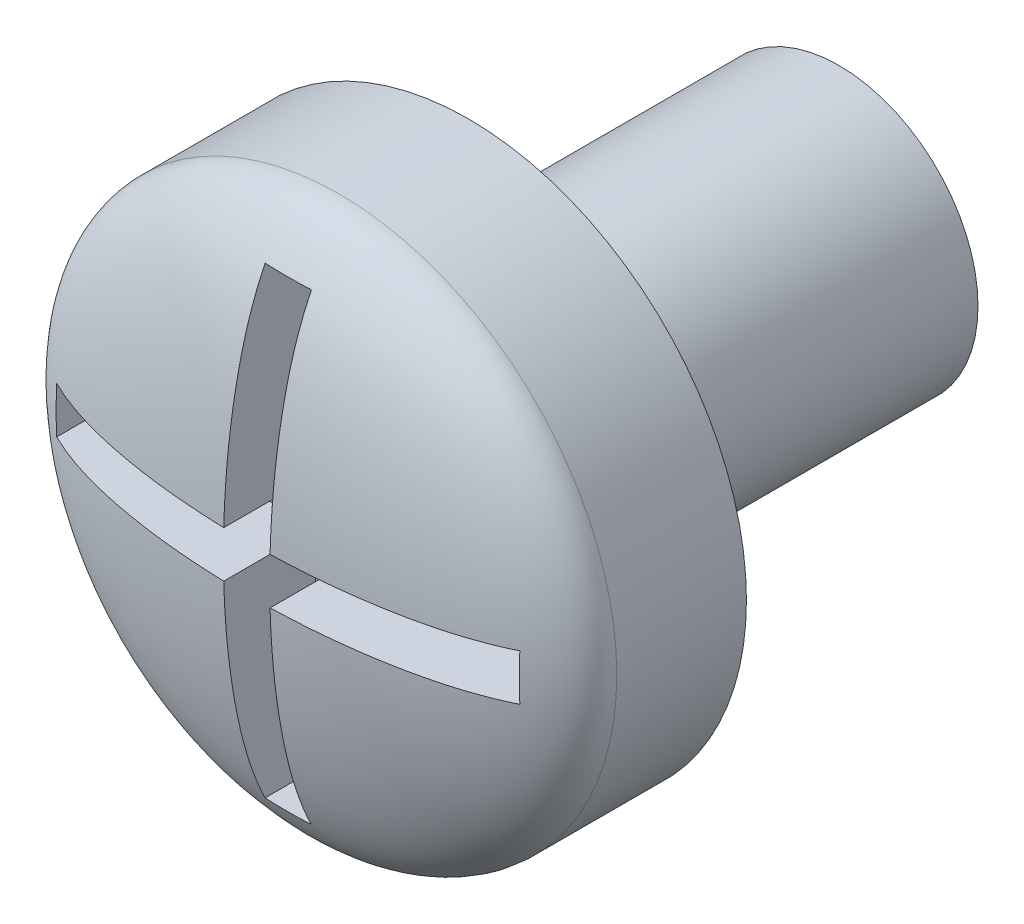
ISO-10303-21;
HEADER;
FILE_DESCRIPTION(('STEP AP214'),'2;1');
FILE_NAME('part.step','',(''),(''),'','','');
FILE_SCHEMA(('AUTOMOTIVE_DESIGN { 1 0 10303 214 1 1 1 1 }'));
ENDSEC;
DATA;
#1=APPLICATION_CONTEXT('core data for automotive mechanical design processes');
#2=APPLICATION_PROTOCOL_DEFINITION('international standard','automotive_design',2000,#1);
#3=PRODUCT_CONTEXT('',#1,'mechanical');
#4=PRODUCT('Part','Part','',(#3));
#5=PRODUCT_RELATED_PRODUCT_CATEGORY('part','',(#4));
#6=PRODUCT_DEFINITION_FORMATION('','',#4);
#7=PRODUCT_DEFINITION_CONTEXT('part definition',#1,'design');
#8=PRODUCT_DEFINITION('design','',#6,#7);
#9=PRODUCT_DEFINITION_SHAPE('','',#8);
#10=(LENGTH_UNIT() NAMED_UNIT(*) SI_UNIT(.MILLI.,.METRE.));
#11=(NAMED_UNIT(*) PLANE_ANGLE_UNIT() SI_UNIT($,.RADIAN.));
#12=(NAMED_UNIT(*) SI_UNIT($,.STERADIAN.) SOLID_ANGLE_UNIT());
#13=UNCERTAINTY_MEASURE_WITH_UNIT(LENGTH_MEASURE(1.E-05),#10,'distance_accuracy_value','');
#14=(GEOMETRIC_REPRESENTATION_CONTEXT(3) GLOBAL_UNCERTAINTY_ASSIGNED_CONTEXT((#13)) GLOBAL_UNIT_ASSIGNED_CONTEXT((#10,
#11,#12)) REPRESENTATION_CONTEXT('',''));
#15=CARTESIAN_POINT('',(0.,0.,0.));
#16=DIRECTION('',(0.,0.,1.));
#17=DIRECTION('',(1.,0.,0.));
#18=AXIS2_PLACEMENT_3D('',#15,#16,#17);
#19=CARTESIAN_POINT('',(0.,0.,-2.4));
#20=DIRECTION('',(0.,0.,1.));
#21=DIRECTION('',(1.,0.,0.));
#22=AXIS2_PLACEMENT_3D('',#19,#20,#21);
#23=CYLINDRICAL_SURFACE('',#22,3.);
#24=CARTESIAN_POINT('',(0.,0.,-2.4));
#25=DIRECTION('',(0.,0.,1.));
#26=DIRECTION('',(1.,0.,0.));
#27=AXIS2_PLACEMENT_3D('',#24,#25,#26);
#28=CIRCLE('',#27,3.);
#29=CARTESIAN_POINT('',(3.,0.,-2.4));
#30=VERTEX_POINT('',#29);
#31=EDGE_CURVE('E200',#30,#30,#28,.T.);
#32=ORIENTED_EDGE('',*,*,#31,.T.);
#33=EDGE_LOOP('',(#32));
#34=FACE_BOUND('',#33,.T.);
#35=CARTESIAN_POINT('',(0.,0.,-0.999999999999999));
#36=DIRECTION('',(0.,0.,1.));
#37=DIRECTION('',(1.,0.,0.));
#38=AXIS2_PLACEMENT_3D('',#35,#36,#37);
#39=CIRCLE('',#38,3.);
#40=CARTESIAN_POINT('',(3.,0.,-0.999999999999999));
#41=VERTEX_POINT('',#40);
#42=EDGE_CURVE('E199',#41,#41,#39,.T.);
#43=ORIENTED_EDGE('',*,*,#42,.F.);
#44=EDGE_LOOP('',(#43));
#45=FACE_BOUND('',#44,.T.);
#46=ADVANCED_FACE('F32',(#34,#45),#23,.T.);
#47=CARTESIAN_POINT('',(0.,0.,-2.4));
#48=DIRECTION('',(0.,0.,1.));
#49=DIRECTION('',(1.,0.,0.));
#50=AXIS2_PLACEMENT_3D('',#47,#48,#49);
#51=PLANE('',#50);
#52=CARTESIAN_POINT('',(0.,0.,-2.4));
#53=DIRECTION('',(0.,0.,1.));
#54=DIRECTION('',(1.,0.,0.));
#55=AXIS2_PLACEMENT_3D('',#52,#53,#54);
#56=CIRCLE('',#55,1.5);
#57=CARTESIAN_POINT('',(1.5,0.,-2.4));
#58=VERTEX_POINT('',#57);
#59=EDGE_CURVE('E203',#58,#58,#56,.F.);
#60=ORIENTED_EDGE('',*,*,#59,.F.);
#61=EDGE_LOOP('',(#60));
#62=FACE_BOUND('',#61,.T.);
#63=ORIENTED_EDGE('',*,*,#31,.F.);
#64=EDGE_LOOP('',(#63));
#65=FACE_BOUND('',#64,.T.);
#66=ADVANCED_FACE('F238',(#62,#65),#51,.F.);
#67=CARTESIAN_POINT('',(0.,0.,-0.999999999999999));
#68=DIRECTION('',(0.,1.,0.));
#69=DIRECTION('',(1.,0.,0.));
#70=AXIS2_PLACEMENT_3D('',#67,#68,#69);
#71=ELLIPSE('',#70,3.,1.);
#72=TRIMMED_CURVE('',#71,(PARAMETER_VALUE(4.71238898038469)),
(PARAMETER_VALUE(7.85398163397448)),.T.,.PARAMETER.);
#73=CARTESIAN_POINT('',(0.,0.,-2.));
#74=DIRECTION('',(0.,0.,1.));
#75=AXIS1_PLACEMENT('',#73,#74);
#76=SURFACE_OF_REVOLUTION('',#72,#75);
#77=CARTESIAN_POINT('',(-2.49999999999994,0.249999999999993,-0.453546789641425));
#78=CARTESIAN_POINT('',(-2.49999999999999,0.166666666666663,-0.449335064285271));
#79=CARTESIAN_POINT('',(-2.50000000000002,0.0833333333333335,-0.447229201607193));
#80=CARTESIAN_POINT('',(-2.49999999999999,-0.0833333333333263,-0.447229201607193));
#81=CARTESIAN_POINT('',(-2.49999999999994,-0.166666666666656,-0.449335064285271));
#82=CARTESIAN_POINT('',(-2.49999999999986,-0.249999999999986,-0.453546789641425));
#83=B_SPLINE_CURVE_WITH_KNOTS('',3,(#77,#78,#79,#80,#81,#82),.UNSPECIFIED.,.F.,.F.,(4,2,4),(0.,
0.250079811097508,0.500159622195015),.UNSPECIFIED.);
#84=CARTESIAN_POINT('',(-2.5,0.25,-0.453546789641425));
#85=VERTEX_POINT('',#84);
#86=CARTESIAN_POINT('',(-2.49999999999994,-0.249999999999993,-0.453546789641429));
#87=VERTEX_POINT('',#86);
#88=EDGE_CURVE('E11',#85,#87,#83,.T.);
#89=ORIENTED_EDGE('',*,*,#88,.F.);
#90=CARTESIAN_POINT('',(-2.49999999999994,0.249999999999993,-0.453546789641425));
#91=CARTESIAN_POINT('',(-2.47401567432464,0.249999999999998,-0.44034440705814));
#92=CARTESIAN_POINT('',(-2.44776636255155,0.249999999999999,-0.427678861070425));
#93=CARTESIAN_POINT('',(-2.39483295489631,0.250000000000001,-0.403312449564529));
#94=CARTESIAN_POINT('',(-2.36814899996362,0.25,-0.391611278487393));
#95=CARTESIAN_POINT('',(-2.28772571823395,0.25,-0.357847320134661));
#96=CARTESIAN_POINT('',(-2.23345635202142,0.25,-0.337045416976589));
#97=CARTESIAN_POINT('',(-2.12398602557991,0.25,-0.298212200007187));
#98=CARTESIAN_POINT('',(-2.06878561325245,0.25,-0.28017931576233));
#99=CARTESIAN_POINT('',(-1.9581785557007,0.25,-0.246594440138073));
#100=CARTESIAN_POINT('',(-1.90277817026711,0.25,-0.231021703137642));
#101=CARTESIAN_POINT('',(-1.79142093080343,0.25,-0.20185449827508));
#102=CARTESIAN_POINT('',(-1.73546371093185,0.25,-0.188261437293503));
#103=CARTESIAN_POINT('',(-1.62313622908068,0.25,-0.162839723341837));
#104=CARTESIAN_POINT('',(-1.56676585792357,0.25,-0.151011555790118));
#105=CARTESIAN_POINT('',(-1.44143294937792,0.25,-0.126556589218447));
#106=CARTESIAN_POINT('',(-1.37239543288092,0.25,-0.114314593740788));
#107=CARTESIAN_POINT('',(-1.23399641999479,0.25,-0.0919704062441796));
#108=CARTESIAN_POINT('',(-1.16463501312236,0.25,-0.0818676550593157));
#109=CARTESIAN_POINT('',(-1.02565643100745,0.25,-0.0636296146532634));
#110=CARTESIAN_POINT('',(-0.95603925992339,0.25,-0.0554942935864466));
#111=CARTESIAN_POINT('',(-0.815829605703759,0.25,-0.0409861198258272));
#112=CARTESIAN_POINT('',(-0.745234971420424,0.25,-0.0346341580013009));
#113=CARTESIAN_POINT('',(-0.603909053386993,0.25,-0.0237224830473601));
#114=CARTESIAN_POINT('',(-0.533177771360334,0.25,-0.0191627474603061));
#115=CARTESIAN_POINT('',(-0.391638308285583,0.25,-0.0117789545560156));
#116=CARTESIAN_POINT('',(-0.320830144997712,0.25,-0.00895455770500086));
#117=CARTESIAN_POINT('',(-0.250000000000005,0.249999999999999,-0.0069687260155838));
#118=B_SPLINE_CURVE_WITH_KNOTS('',3,(#90,#91,#92,#93,#94,#95,#96,#97,#98,#99,#100,#101,#102,
#103,#104,#105,#106,#107,#108,#109,#110,#111,#112,#113,#114,#115,#116,#117),.UNSPECIFIED.,.F.,
.F.,(4,2,2,2,2,2,2,2,2,2,2,2,2,4),(0.,0.0874210653962455,0.17481432437277,0.349070740034872,
0.523227959197852,0.695827592181624,0.868549292820274,1.04131841181725,1.25162343490764,
1.4618734194222,1.67212000051673,1.88473547278396,2.09734828077045,2.30991947599496),.UNSPECIFIED.);
#119=CARTESIAN_POINT('',(-0.25,0.25,-0.00696872601558401));
#120=VERTEX_POINT('',#119);
#121=EDGE_CURVE('E46',#85,#120,#118,.T.);
#122=ORIENTED_EDGE('',*,*,#121,.T.);
#123=CARTESIAN_POINT('',(-0.249999999999993,2.49999999999994,-0.453546789641428));
#124=CARTESIAN_POINT('',(-0.249999999999998,2.47401567432464,-0.440344407058142));
#125=CARTESIAN_POINT('',(-0.249999999999999,2.44776636255155,-0.427678861070427));
#126=CARTESIAN_POINT('',(-0.250000000000001,2.39483295489631,-0.403312449564531));
#127=CARTESIAN_POINT('',(-0.25,2.36814899996362,-0.391611278487395));
#128=CARTESIAN_POINT('',(-0.25,2.28772571823395,-0.357847320134663));
#129=CARTESIAN_POINT('',(-0.25,2.23345635202143,-0.33704541697659));
#130=CARTESIAN_POINT('',(-0.25,2.12398602557991,-0.298212200007189));
#131=CARTESIAN_POINT('',(-0.25,2.06878561325246,-0.280179315762332));
#132=CARTESIAN_POINT('',(-0.25,1.95817855570071,-0.246594440138075));
#133=CARTESIAN_POINT('',(-0.25,1.90277817026712,-0.231021703137644));
#134=CARTESIAN_POINT('',(-0.25,1.79142093080344,-0.201854498275082));
#135=CARTESIAN_POINT('',(-0.25,1.73546371093186,-0.188261437293506));
#136=CARTESIAN_POINT('',(-0.25,1.62313622908069,-0.162839723341839));
#137=CARTESIAN_POINT('',(-0.25,1.56676585792358,-0.15101155579012));
#138=CARTESIAN_POINT('',(-0.25,1.44143294937793,-0.126556589218449));
#139=CARTESIAN_POINT('',(-0.25,1.37239543288093,-0.11431459374079));
#140=CARTESIAN_POINT('',(-0.25,1.2339964199948,-0.0919704062441807));
#141=CARTESIAN_POINT('',(-0.25,1.16463501312237,-0.0818676550593168));
#142=CARTESIAN_POINT('',(-0.25,1.02565643100746,-0.0636296146532643));
#143=CARTESIAN_POINT('',(-0.25,0.956039259923395,-0.0554942935864474));
#144=CARTESIAN_POINT('',(-0.25,0.815829605703763,-0.0409861198258274));
#145=CARTESIAN_POINT('',(-0.25,0.745234971420427,-0.0346341580013008));
#146=CARTESIAN_POINT('',(-0.25,0.603909053386994,-0.0237224830473598));
#147=CARTESIAN_POINT('',(-0.25,0.533177771360334,-0.0191627474603059));
#148=CARTESIAN_POINT('',(-0.25,0.391638308285581,-0.0117789545560157));
#149=CARTESIAN_POINT('',(-0.25,0.32083014499771,-0.00895455770500105));
#150=CARTESIAN_POINT('',(-0.249999999999999,0.250000000000001,-0.0069687260155838));
#151=B_SPLINE_CURVE_WITH_KNOTS('',3,(#123,#124,#125,#126,#127,#128,#129,#130,#131,#132,#133,
#134,#135,#136,#137,#138,#139,#140,#141,#142,#143,#144,#145,#146,#147,#148,#149,#150),
.UNSPECIFIED.,.F.,.F.,(4,2,2,2,2,2,2,2,2,2,2,2,2,4),(0.,0.0874210653962447,0.174814324372768,
0.349070740034869,0.523227959197848,0.695827592181619,0.868549292820267,1.04131841181724,
1.25162343490763,1.46187341942219,1.67212000051673,1.88473547278396,2.09734828077045,
2.30991947599496),.UNSPECIFIED.);
#152=CARTESIAN_POINT('',(-0.25,2.5,-0.453546789641428));
#153=VERTEX_POINT('',#152);
#154=EDGE_CURVE('E438',#153,#120,#151,.T.);
#155=ORIENTED_EDGE('',*,*,#154,.F.);
#156=CARTESIAN_POINT('',(-0.249999999999993,2.49999999999994,-0.453546789641428));
#157=CARTESIAN_POINT('',(-0.166666666666663,2.49999999999999,-0.449335064285272));
#158=CARTESIAN_POINT('',(-0.0833333333333332,2.50000000000002,-0.447229201607194));
#159=CARTESIAN_POINT('',(0.083333333333327,2.49999999999999,-0.447229201607193));
#160=CARTESIAN_POINT('',(0.166666666666657,2.49999999999994,-0.44933506428527));
#161=CARTESIAN_POINT('',(0.249999999999987,2.49999999999985,-0.453546789641424));
#162=B_SPLINE_CURVE_WITH_KNOTS('',3,(#156,#157,#158,#159,#160,#161),.UNSPECIFIED.,.F.,.F.,(4,2,
4),(0.,0.250079811097508,0.500159622195017),.UNSPECIFIED.);
#163=CARTESIAN_POINT('',(0.25,2.5,-0.453546789641425));
#164=VERTEX_POINT('',#163);
#165=EDGE_CURVE('E443',#153,#164,#162,.T.);
#166=ORIENTED_EDGE('',*,*,#165,.T.);
#167=CARTESIAN_POINT('',(0.249999999999994,2.49999999999994,-0.453546789641425));
#168=CARTESIAN_POINT('',(0.249999999999998,2.47401567432464,-0.44034440705814));
#169=CARTESIAN_POINT('',(0.249999999999999,2.44776636255155,-0.427678861070425));
#170=CARTESIAN_POINT('',(0.250000000000001,2.39483295489631,-0.403312449564529));
#171=CARTESIAN_POINT('',(0.25,2.36814899996362,-0.391611278487394));
#172=CARTESIAN_POINT('',(0.25,2.28772571823395,-0.357847320134661));
#173=CARTESIAN_POINT('',(0.25,2.23345635202142,-0.337045416976588));
#174=CARTESIAN_POINT('',(0.25,2.1239860255799,-0.298212200007187));
#175=CARTESIAN_POINT('',(0.25,2.06878561325245,-0.28017931576233));
#176=CARTESIAN_POINT('',(0.25,1.9581785557007,-0.246594440138072));
#177=CARTESIAN_POINT('',(0.25,1.90277817026711,-0.231021703137642));
#178=CARTESIAN_POINT('',(0.25,1.79142093080343,-0.20185449827508));
#179=CARTESIAN_POINT('',(0.25,1.73546371093185,-0.188261437293503));
#180=CARTESIAN_POINT('',(0.25,1.62313622908067,-0.162839723341837));
#181=CARTESIAN_POINT('',(0.25,1.56676585792357,-0.151011555790118));
#182=CARTESIAN_POINT('',(0.25,1.44143294937792,-0.126556589218447));
#183=CARTESIAN_POINT('',(0.25,1.37239543288092,-0.114314593740788));
#184=CARTESIAN_POINT('',(0.25,1.23399641999479,-0.0919704062441793));
#185=CARTESIAN_POINT('',(0.25,1.16463501312236,-0.0818676550593155));
#186=CARTESIAN_POINT('',(0.25,1.02565643100745,-0.0636296146532633));
#187=CARTESIAN_POINT('',(0.25,0.956039259923388,-0.0554942935864465));
#188=CARTESIAN_POINT('',(0.25,0.815829605703758,-0.040986119825827));
#189=CARTESIAN_POINT('',(0.25,0.745234971420423,-0.0346341580013007));
#190=CARTESIAN_POINT('',(0.25,0.603909053386992,-0.0237224830473599));
#191=CARTESIAN_POINT('',(0.25,0.533177771360333,-0.019162747460306));
#192=CARTESIAN_POINT('',(0.25,0.391638308285582,-0.0117789545560157));
#193=CARTESIAN_POINT('',(0.25,0.320830144997712,-0.00895455770500094));
#194=CARTESIAN_POINT('',(0.249999999999999,0.250000000000005,-0.0069687260155838));
#195=B_SPLINE_CURVE_WITH_KNOTS('',3,(#167,#168,#169,#170,#171,#172,#173,#174,#175,#176,#177,
#178,#179,#180,#181,#182,#183,#184,#185,#186,#187,#188,#189,#190,#191,#192,#193,#194),
.UNSPECIFIED.,.F.,.F.,(4,2,2,2,2,2,2,2,2,2,2,2,2,4),(0.,0.0874210653962455,0.17481432437277,
0.349070740034873,0.523227959197853,0.695827592181626,0.868549292820276,1.04131841181725,
1.25162343490764,1.4618734194222,1.67212000051673,1.88473547278396,2.09734828077045,
2.30991947599496),.UNSPECIFIED.);
#196=CARTESIAN_POINT('',(0.25,0.25,-0.00696872601558401));
#197=VERTEX_POINT('',#196);
#198=EDGE_CURVE('E449',#164,#197,#195,.T.);
#199=ORIENTED_EDGE('',*,*,#198,.T.);
#200=CARTESIAN_POINT('',(0.250000000000002,0.250000000000006,-0.00696872601558412));
#201=CARTESIAN_POINT('',(0.366874491647124,0.250000000000002,-0.0102764570641947));
#202=CARTESIAN_POINT('',(0.483708541255001,0.250000000000001,-0.0158189320445028));
#203=CARTESIAN_POINT('',(0.71822486313994,0.249999999999999,-0.0318217681259243));
#204=CARTESIAN_POINT('',(0.83590375307461,0.25,-0.0423313333517849));
#205=CARTESIAN_POINT('',(1.03207823943118,0.25,-0.0643370857593262));
#206=CARTESIAN_POINT('',(1.11073827664621,0.25,-0.0743733444459725));
#207=CARTESIAN_POINT('',(1.26770340645223,0.25,-0.0970566263047003));
#208=CARTESIAN_POINT('',(1.34600841251767,0.249999999999999,-0.109704254265077));
#209=CARTESIAN_POINT('',(1.50216736387422,0.250000000000001,-0.137903895993583));
#210=CARTESIAN_POINT('',(1.58002086239122,0.250000000000003,-0.153458402841061));
#211=CARTESIAN_POINT('',(1.73448523961447,0.249999999999997,-0.187758590909665));
#212=CARTESIAN_POINT('',(1.81110094443146,0.24999999999999,-0.206482270725408));
#213=CARTESIAN_POINT('',(1.96324603635538,0.25000000000001,-0.24775991926567));
#214=CARTESIAN_POINT('',(2.03877612605305,0.250000000000036,-0.270311277398305));
#215=CARTESIAN_POINT('',(2.18820239973701,0.249999999999964,-0.32009254694743));
#216=CARTESIAN_POINT('',(2.26210081002517,0.249999999999867,-0.347315573564706));
#217=CARTESIAN_POINT('',(2.36269507751663,0.249999999999934,-0.389248327418535));
#218=CARTESIAN_POINT('',(2.39047696044334,0.249999999999974,-0.40136051178253));
#219=CARTESIAN_POINT('',(2.44560191136815,0.250000000000026,-0.426635453076718));
#220=CARTESIAN_POINT('',(2.47294435234515,0.250000000000038,-0.439799574421764));
#221=CARTESIAN_POINT('',(2.49999999999992,0.25,-0.45354678964146));
#222=B_SPLINE_CURVE_WITH_KNOTS('',3,(#200,#201,#202,#203,#204,#205,#206,#207,#208,#209,#210,
#211,#212,#213,#214,#215,#216,#217,#218,#219,#220,#221),.UNSPECIFIED.,.F.,.F.,(4,2,2,2,2,2,2,2,
2,2,4),(0.,0.350779408773837,0.705108905634526,0.942964299193114,1.18087484153652,
1.41899037169375,1.65551597097249,1.89188089616542,2.12790042761102,2.21880405056447,
2.30982755593696),.UNSPECIFIED.);
#223=CARTESIAN_POINT('',(2.5,0.25,-0.453546789641428));
#224=VERTEX_POINT('',#223);
#225=EDGE_CURVE('E458',#197,#224,#222,.T.);
#226=ORIENTED_EDGE('',*,*,#225,.T.);
#227=CARTESIAN_POINT('',(2.49999999999994,0.249999999999993,-0.453546789641428));
#228=CARTESIAN_POINT('',(2.5,0.166666666666663,-0.449335064285272));
#229=CARTESIAN_POINT('',(2.50000000000002,0.0833333333333336,-0.447229201607194));
#230=CARTESIAN_POINT('',(2.49999999999999,-0.0833333333333261,-0.447229201607193));
#231=CARTESIAN_POINT('',(2.49999999999994,-0.166666666666656,-0.44933506428527));
#232=CARTESIAN_POINT('',(2.49999999999986,-0.249999999999986,-0.453546789641425));
#233=B_SPLINE_CURVE_WITH_KNOTS('',3,(#227,#228,#229,#230,#231,#232),.UNSPECIFIED.,.F.,.F.,(4,2,
4),(0.,0.250079811097508,0.500159622195015),.UNSPECIFIED.);
#234=CARTESIAN_POINT('',(2.5,-0.25,-0.453546789641425));
#235=VERTEX_POINT('',#234);
#236=EDGE_CURVE('E272',#224,#235,#233,.T.);
#237=ORIENTED_EDGE('',*,*,#236,.T.);
#238=CARTESIAN_POINT('',(0.250000000000006,-0.250000000000002,-0.00696872601558412));
#239=CARTESIAN_POINT('',(0.366874491647127,-0.250000000000001,-0.010276457064195));
#240=CARTESIAN_POINT('',(0.483708541255004,-0.250000000000001,-0.0158189320445031));
#241=CARTESIAN_POINT('',(0.718224863139944,-0.249999999999999,-0.0318217681259245));
#242=CARTESIAN_POINT('',(0.835903753074613,-0.249999999999999,-0.042331333351785));
#243=CARTESIAN_POINT('',(1.03207823943119,-0.25,-0.0643370857593264));
#244=CARTESIAN_POINT('',(1.11073827664622,-0.25,-0.0743733444459729));
#245=CARTESIAN_POINT('',(1.26770340645223,-0.25,-0.0970566263047009));
#246=CARTESIAN_POINT('',(1.34600841251768,-0.249999999999999,-0.109704254265078));
#247=CARTESIAN_POINT('',(1.50216736387423,-0.250000000000001,-0.137903895993583));
#248=CARTESIAN_POINT('',(1.58002086239122,-0.250000000000003,-0.153458402841062));
#249=CARTESIAN_POINT('',(1.73448523961447,-0.249999999999997,-0.187758590909666));
#250=CARTESIAN_POINT('',(1.81110094443147,-0.24999999999999,-0.206482270725408));
#251=CARTESIAN_POINT('',(1.96324603635538,-0.25000000000001,-0.247759919265671));
#252=CARTESIAN_POINT('',(2.03877612605305,-0.250000000000036,-0.270311277398305));
#253=CARTESIAN_POINT('',(2.18820239973702,-0.249999999999964,-0.320092546947431));
#254=CARTESIAN_POINT('',(2.26210081002517,-0.249999999999867,-0.347315573564707));
#255=CARTESIAN_POINT('',(2.36269507751664,-0.249999999999934,-0.389248327418536));
#256=CARTESIAN_POINT('',(2.39047696044334,-0.249999999999974,-0.401360511782531));
#257=CARTESIAN_POINT('',(2.44560191136815,-0.250000000000026,-0.426635453076718));
#258=CARTESIAN_POINT('',(2.47294435234515,-0.250000000000038,-0.439799574421763));
#259=CARTESIAN_POINT('',(2.49999999999992,-0.249999999999999,-0.453546789641459));
#260=B_SPLINE_CURVE_WITH_KNOTS('',3,(#238,#239,#240,#241,#242,#243,#244,#245,#246,#247,#248,
#249,#250,#251,#252,#253,#254,#255,#256,#257,#258,#259),.UNSPECIFIED.,.F.,.F.,(4,2,2,2,2,2,2,2,
2,2,4),(0.,0.350779408773837,0.705108905634526,0.942964299193113,1.18087484153652,
1.41899037169375,1.65551597097249,1.89188089616542,2.12790042761102,2.21880405056447,
2.30982755593695),.UNSPECIFIED.);
#261=CARTESIAN_POINT('',(0.25,-0.25,-0.00696872601558401));
#262=VERTEX_POINT('',#261);
#263=EDGE_CURVE('E270',#262,#235,#260,.T.);
#264=ORIENTED_EDGE('',*,*,#263,.F.);
#265=CARTESIAN_POINT('',(0.250000000000006,-0.250000000000002,-0.00696872601558412));
#266=CARTESIAN_POINT('',(0.250000000000002,-0.366874491647124,-0.0102764570641946));
#267=CARTESIAN_POINT('',(0.250000000000001,-0.483708541255001,-0.0158189320445027));
#268=CARTESIAN_POINT('',(0.249999999999999,-0.718224863139941,-0.0318217681259243));
#269=CARTESIAN_POINT('',(0.25,-0.83590375307461,-0.0423313333517849));
#270=CARTESIAN_POINT('',(0.25,-1.03207823943118,-0.0643370857593261));
#271=CARTESIAN_POINT('',(0.25,-1.11073827664621,-0.0743733444459724));
#272=CARTESIAN_POINT('',(0.25,-1.26770340645223,-0.0970566263047002));
#273=CARTESIAN_POINT('',(0.249999999999999,-1.34600841251767,-0.109704254265077));
#274=CARTESIAN_POINT('',(0.250000000000001,-1.50216736387422,-0.137903895993583));
#275=CARTESIAN_POINT('',(0.250000000000003,-1.58002086239121,-0.153458402841061));
#276=CARTESIAN_POINT('',(0.249999999999997,-1.73448523961447,-0.187758590909665));
#277=CARTESIAN_POINT('',(0.249999999999991,-1.81110094443146,-0.206482270725407));
#278=CARTESIAN_POINT('',(0.250000000000009,-1.96324603635538,-0.24775991926567));
#279=CARTESIAN_POINT('',(0.250000000000035,-2.03877612605305,-0.270311277398304));
#280=CARTESIAN_POINT('',(0.249999999999965,-2.18820239973701,-0.32009254694743));
#281=CARTESIAN_POINT('',(0.249999999999868,-2.26210081002517,-0.347315573564706));
#282=CARTESIAN_POINT('',(0.249999999999934,-2.36269507751663,-0.389248327418535));
#283=CARTESIAN_POINT('',(0.249999999999974,-2.39047696044334,-0.40136051178253));
#284=CARTESIAN_POINT('',(0.250000000000026,-2.44560191136815,-0.426635453076718));
#285=CARTESIAN_POINT('',(0.250000000000038,-2.47294435234515,-0.439799574421764));
#286=CARTESIAN_POINT('',(0.25,-2.49999999999992,-0.45354678964146));
#287=B_SPLINE_CURVE_WITH_KNOTS('',3,(#265,#266,#267,#268,#269,#270,#271,#272,#273,#274,#275,
#276,#277,#278,#279,#280,#281,#282,#283,#284,#285,#286),.UNSPECIFIED.,.F.,.F.,(4,2,2,2,2,2,2,2,
2,2,4),(0.,0.350779408773837,0.705108905634526,0.942964299193113,1.18087484153651,
1.41899037169375,1.65551597097249,1.89188089616541,2.12790042761102,2.21880405056447,
2.30982755593696),.UNSPECIFIED.);
#288=CARTESIAN_POINT('',(0.25,-2.5,-0.453546789641428));
#289=VERTEX_POINT('',#288);
#290=EDGE_CURVE('E267',#262,#289,#287,.T.);
#291=ORIENTED_EDGE('',*,*,#290,.T.);
#292=CARTESIAN_POINT('',(-0.249999999999993,-2.49999999999993,-0.453546789641425));
#293=CARTESIAN_POINT('',(-0.166666666666663,-2.49999999999999,-0.44933506428527));
#294=CARTESIAN_POINT('',(-0.0833333333333332,-2.50000000000002,-0.447229201607193));
#295=CARTESIAN_POINT('',(0.0833333333333268,-2.49999999999999,-0.447229201607193));
#296=CARTESIAN_POINT('',(0.166666666666657,-2.49999999999994,-0.44933506428527));
#297=CARTESIAN_POINT('',(0.249999999999987,-2.49999999999985,-0.453546789641424));
#298=B_SPLINE_CURVE_WITH_KNOTS('',3,(#292,#293,#294,#295,#296,#297),.UNSPECIFIED.,.F.,.F.,(4,2,
4),(0.,0.250079811097508,0.500159622195016),.UNSPECIFIED.);
#299=CARTESIAN_POINT('',(-0.25,-2.5,-0.453546789641425));
#300=VERTEX_POINT('',#299);
#301=EDGE_CURVE('E263',#300,#289,#298,.T.);
#302=ORIENTED_EDGE('',*,*,#301,.F.);
#303=CARTESIAN_POINT('',(-0.250000000000002,-0.250000000000006,-0.00696872601558412));
#304=CARTESIAN_POINT('',(-0.250000000000001,-0.366874491647128,-0.0102764570641951));
#305=CARTESIAN_POINT('',(-0.25,-0.483708541255004,-0.0158189320445033));
#306=CARTESIAN_POINT('',(-0.25,-0.718224863139943,-0.0318217681259246));
#307=CARTESIAN_POINT('',(-0.25,-0.835903753074613,-0.042331333351785));
#308=CARTESIAN_POINT('',(-0.25,-1.03207823943119,-0.0643370857593264));
#309=CARTESIAN_POINT('',(-0.25,-1.11073827664622,-0.0743733444459729));
#310=CARTESIAN_POINT('',(-0.25,-1.26770340645223,-0.0970566263047009));
#311=CARTESIAN_POINT('',(-0.249999999999999,-1.34600841251768,-0.109704254265078));
#312=CARTESIAN_POINT('',(-0.250000000000001,-1.50216736387423,-0.137903895993583));
#313=CARTESIAN_POINT('',(-0.250000000000003,-1.58002086239122,-0.153458402841062));
#314=CARTESIAN_POINT('',(-0.249999999999997,-1.73448523961447,-0.187758590909666));
#315=CARTESIAN_POINT('',(-0.24999999999999,-1.81110094443147,-0.206482270725408));
#316=CARTESIAN_POINT('',(-0.25000000000001,-1.96324603635538,-0.247759919265671));
#317=CARTESIAN_POINT('',(-0.250000000000036,-2.03877612605305,-0.270311277398305));
#318=CARTESIAN_POINT('',(-0.249999999999964,-2.18820239973702,-0.320092546947431));
#319=CARTESIAN_POINT('',(-0.249999999999866,-2.26210081002517,-0.347315573564708));
#320=CARTESIAN_POINT('',(-0.249999999999933,-2.36269507751664,-0.389248327418535));
#321=CARTESIAN_POINT('',(-0.249999999999974,-2.39047696044334,-0.40136051178253));
#322=CARTESIAN_POINT('',(-0.250000000000026,-2.44560191136815,-0.426635453076717));
#323=CARTESIAN_POINT('',(-0.250000000000038,-2.47294435234515,-0.439799574421762));
#324=CARTESIAN_POINT('',(-0.250000000000001,-2.49999999999992,-0.453546789641458));
#325=B_SPLINE_CURVE_WITH_KNOTS('',3,(#303,#304,#305,#306,#307,#308,#309,#310,#311,#312,#313,
#314,#315,#316,#317,#318,#319,#320,#321,#322,#323,#324),.UNSPECIFIED.,.F.,.F.,(4,2,2,2,2,2,2,2,
2,2,4),(0.,0.350779408773837,0.705108905634526,0.942964299193113,1.18087484153651,
1.41899037169375,1.65551597097249,1.89188089616542,2.12790042761102,2.21880405056446,
2.30982755593695),.UNSPECIFIED.);
#326=CARTESIAN_POINT('',(-0.25,-0.25,-0.00696872601558401));
#327=VERTEX_POINT('',#326);
#328=EDGE_CURVE('E215',#327,#300,#325,.T.);
#329=ORIENTED_EDGE('',*,*,#328,.F.);
#330=CARTESIAN_POINT('',(-2.49999999999994,-0.249999999999993,-0.453546789641429));
#331=CARTESIAN_POINT('',(-2.47401567432464,-0.249999999999998,-0.440344407058143));
#332=CARTESIAN_POINT('',(-2.44776636255155,-0.249999999999999,-0.427678861070427));
#333=CARTESIAN_POINT('',(-2.39483295489631,-0.250000000000001,-0.403312449564532));
#334=CARTESIAN_POINT('',(-2.36814899996363,-0.25,-0.391611278487396));
#335=CARTESIAN_POINT('',(-2.28772571823395,-0.25,-0.357847320134664));
#336=CARTESIAN_POINT('',(-2.23345635202143,-0.25,-0.337045416976591));
#337=CARTESIAN_POINT('',(-2.12398602557992,-0.25,-0.29821220000719));
#338=CARTESIAN_POINT('',(-2.06878561325246,-0.25,-0.280179315762333));
#339=CARTESIAN_POINT('',(-1.95817855570071,-0.25,-0.246594440138076));
#340=CARTESIAN_POINT('',(-1.90277817026713,-0.25,-0.231021703137646));
#341=CARTESIAN_POINT('',(-1.79142093080345,-0.25,-0.201854498275083));
#342=CARTESIAN_POINT('',(-1.73546371093187,-0.25,-0.188261437293507));
#343=CARTESIAN_POINT('',(-1.62313622908069,-0.25,-0.162839723341841));
#344=CARTESIAN_POINT('',(-1.56676585792359,-0.25,-0.151011555790122));
#345=CARTESIAN_POINT('',(-1.44143294937794,-0.25,-0.126556589218451));
#346=CARTESIAN_POINT('',(-1.37239543288094,-0.25,-0.114314593740791));
#347=CARTESIAN_POINT('',(-1.23399641999481,-0.25,-0.0919704062441818));
#348=CARTESIAN_POINT('',(-1.16463501312238,-0.25,-0.0818676550593175));
#349=CARTESIAN_POINT('',(-1.02565643100746,-0.25,-0.0636296146532646));
#350=CARTESIAN_POINT('',(-0.956039259923399,-0.25,-0.0554942935864477));
#351=CARTESIAN_POINT('',(-0.815829605703766,-0.25,-0.0409861198258277));
#352=CARTESIAN_POINT('',(-0.74523497142043,-0.25,-0.0346341580013011));
#353=CARTESIAN_POINT('',(-0.603909053386996,-0.25,-0.0237224830473598));
#354=CARTESIAN_POINT('',(-0.533177771360335,-0.25,-0.0191627474603057));
#355=CARTESIAN_POINT('',(-0.391638308285582,-0.25,-0.0117789545560154));
#356=CARTESIAN_POINT('',(-0.32083014499771,-0.25,-0.00895455770500075));
#357=CARTESIAN_POINT('',(-0.250000000000002,-0.249999999999999,-0.0069687260155838));
#358=B_SPLINE_CURVE_WITH_KNOTS('',3,(#330,#331,#332,#333,#334,#335,#336,#337,#338,#339,#340,
#341,#342,#343,#344,#345,#346,#347,#348,#349,#350,#351,#352,#353,#354,#355,#356,#357),
.UNSPECIFIED.,.F.,.F.,(4,2,2,2,2,2,2,2,2,2,2,2,2,4),(0.,0.0874210653962443,0.174814324372767,
0.349070740034867,0.523227959197844,0.695827592181615,0.868549292820262,1.04131841181723,
1.25162343490763,1.46187341942219,1.67212000051673,1.88473547278396,2.09734828077045,
2.30991947599496),.UNSPECIFIED.);
#359=EDGE_CURVE('E209',#87,#327,#358,.T.);
#360=ORIENTED_EDGE('',*,*,#359,.F.);
#361=EDGE_LOOP('',(#89,#122,#155,#166,#199,#226,#237,#264,#291,#302,#329,#360));
#362=FACE_BOUND('',#361,.T.);
#363=ORIENTED_EDGE('',*,*,#42,.T.);
#364=EDGE_LOOP('',(#363));
#365=FACE_BOUND('',#364,.T.);
#366=ADVANCED_FACE('F34',(#362,#365),#76,.F.);
#367=CARTESIAN_POINT('',(0.,0.,-6.4));
#368=DIRECTION('',(0.,0.,1.));
#369=DIRECTION('',(1.,0.,0.));
#370=AXIS2_PLACEMENT_3D('',#367,#368,#369);
#371=CYLINDRICAL_SURFACE('',#370,1.5);
#372=CARTESIAN_POINT('',(0.,0.,-6.4));
#373=DIRECTION('',(0.,0.,-1.));
#374=DIRECTION('',(-1.,0.,0.));
#375=AXIS2_PLACEMENT_3D('',#372,#373,#374);
#376=CIRCLE('',#375,1.5);
#377=CARTESIAN_POINT('',(-1.5,0.,-6.4));
#378=VERTEX_POINT('',#377);
#379=EDGE_CURVE('E169',#378,#378,#376,.T.);
#380=ORIENTED_EDGE('',*,*,#379,.F.);
#381=EDGE_LOOP('',(#380));
#382=FACE_BOUND('',#381,.T.);
#383=ORIENTED_EDGE('',*,*,#59,.T.);
#384=EDGE_LOOP('',(#383));
#385=FACE_BOUND('',#384,.T.);
#386=ADVANCED_FACE('F233',(#382,#385),#371,.T.);
#387=CARTESIAN_POINT('',(0.,0.,-6.4));
#388=DIRECTION('',(0.,0.,-1.));
#389=DIRECTION('',(-1.,0.,0.));
#390=AXIS2_PLACEMENT_3D('',#387,#388,#389);
#391=PLANE('',#390);
#392=ORIENTED_EDGE('',*,*,#379,.T.);
#393=EDGE_LOOP('',(#392));
#394=FACE_BOUND('',#393,.T.);
#395=ADVANCED_FACE('F230',(#394),#391,.T.);
#396=CARTESIAN_POINT('',(-2.5,0.,-1.));
#397=DIRECTION('',(-1.,0.,0.));
#398=DIRECTION('',(0.,-1.,0.));
#399=AXIS2_PLACEMENT_3D('',#396,#397,#398);
#400=PLANE('',#399);
#401=ORIENTED_EDGE('',*,*,#88,.T.);
#402=DIRECTION('',(0.,0.,1.));
#403=VECTOR('',#402,1.);
#404=CARTESIAN_POINT('',(-2.5,-0.25,-1.));
#405=LINE('',#404,#403);
#406=CARTESIAN_POINT('',(-2.5,-0.25,-1.));
#407=VERTEX_POINT('',#406);
#408=EDGE_CURVE('E53',#407,#87,#405,.T.);
#409=ORIENTED_EDGE('',*,*,#408,.F.);
#410=DIRECTION('',(0.,-1.,0.));
#411=VECTOR('',#410,1.);
#412=CARTESIAN_POINT('',(-2.5,0.,-1.));
#413=LINE('',#412,#411);
#414=CARTESIAN_POINT('',(-2.5,0.25,-1.));
#415=VERTEX_POINT('',#414);
#416=EDGE_CURVE('E127',#415,#407,#413,.T.);
#417=ORIENTED_EDGE('',*,*,#416,.F.);
#418=DIRECTION('',(0.,0.,1.));
#419=VECTOR('',#418,1.);
#420=CARTESIAN_POINT('',(-2.5,0.25,-1.));
#421=LINE('',#420,#419);
#422=EDGE_CURVE('E167',#415,#85,#421,.T.);
#423=ORIENTED_EDGE('',*,*,#422,.T.);
#424=EDGE_LOOP('',(#401,#409,#417,#423));
#425=FACE_BOUND('',#424,.T.);
#426=ADVANCED_FACE('F125',(#425),#400,.F.);
#427=CARTESIAN_POINT('',(0.,0.25,-1.));
#428=DIRECTION('',(0.,-1.,0.));
#429=DIRECTION('',(0.,0.,-1.));
#430=AXIS2_PLACEMENT_3D('',#427,#428,#429);
#431=PLANE('',#430);
#432=ORIENTED_EDGE('',*,*,#422,.F.);
#433=DIRECTION('',(1.,0.,0.));
#434=VECTOR('',#433,1.);
#435=CARTESIAN_POINT('',(0.,0.25,-1.));
#436=LINE('',#435,#434);
#437=CARTESIAN_POINT('',(-0.25,0.25,-1.));
#438=VERTEX_POINT('',#437);
#439=EDGE_CURVE('E131',#415,#438,#436,.T.);
#440=ORIENTED_EDGE('',*,*,#439,.T.);
#441=DIRECTION('',(0.,0.,1.));
#442=VECTOR('',#441,1.);
#443=CARTESIAN_POINT('',(-0.25,0.25,-1.));
#444=LINE('',#443,#442);
#445=EDGE_CURVE('E170',#438,#120,#444,.T.);
#446=ORIENTED_EDGE('',*,*,#445,.T.);
#447=ORIENTED_EDGE('',*,*,#121,.F.);
#448=EDGE_LOOP('',(#432,#440,#446,#447));
#449=FACE_BOUND('',#448,.T.);
#450=ADVANCED_FACE('F229',(#449),#431,.T.);
#451=CARTESIAN_POINT('',(-0.25,0.,-1.));
#452=DIRECTION('',(-1.,0.,0.));
#453=DIRECTION('',(0.,0.,1.));
#454=AXIS2_PLACEMENT_3D('',#451,#452,#453);
#455=PLANE('',#454);
#456=ORIENTED_EDGE('',*,*,#154,.T.);
#457=ORIENTED_EDGE('',*,*,#445,.F.);
#458=DIRECTION('',(0.,-1.,0.));
#459=VECTOR('',#458,1.);
#460=CARTESIAN_POINT('',(-0.25,0.,-1.));
#461=LINE('',#460,#459);
#462=CARTESIAN_POINT('',(-0.25,2.5,-1.));
#463=VERTEX_POINT('',#462);
#464=EDGE_CURVE('E164',#463,#438,#461,.T.);
#465=ORIENTED_EDGE('',*,*,#464,.F.);
#466=DIRECTION('',(0.,0.,1.));
#467=VECTOR('',#466,1.);
#468=CARTESIAN_POINT('',(-0.25,2.5,-1.));
#469=LINE('',#468,#467);
#470=EDGE_CURVE('E172',#463,#153,#469,.T.);
#471=ORIENTED_EDGE('',*,*,#470,.T.);
#472=EDGE_LOOP('',(#456,#457,#465,#471));
#473=FACE_BOUND('',#472,.T.);
#474=ADVANCED_FACE('F374',(#473),#455,.F.);
#475=CARTESIAN_POINT('',(0.,2.5,-1.));
#476=DIRECTION('',(0.,-1.,0.));
#477=DIRECTION('',(1.,0.,0.));
#478=AXIS2_PLACEMENT_3D('',#475,#476,#477);
#479=PLANE('',#478);
#480=ORIENTED_EDGE('',*,*,#470,.F.);
#481=DIRECTION('',(1.,0.,0.));
#482=VECTOR('',#481,1.);
#483=CARTESIAN_POINT('',(0.,2.5,-1.));
#484=LINE('',#483,#482);
#485=CARTESIAN_POINT('',(0.25,2.5,-1.));
#486=VERTEX_POINT('',#485);
#487=EDGE_CURVE('E162',#463,#486,#484,.T.);
#488=ORIENTED_EDGE('',*,*,#487,.T.);
#489=DIRECTION('',(0.,0.,1.));
#490=VECTOR('',#489,1.);
#491=CARTESIAN_POINT('',(0.25,2.5,-1.));
#492=LINE('',#491,#490);
#493=EDGE_CURVE('E175',#486,#164,#492,.T.);
#494=ORIENTED_EDGE('',*,*,#493,.T.);
#495=ORIENTED_EDGE('',*,*,#165,.F.);
#496=EDGE_LOOP('',(#480,#488,#494,#495));
#497=FACE_BOUND('',#496,.T.);
#498=ADVANCED_FACE('F365',(#497),#479,.T.);
#499=CARTESIAN_POINT('',(0.25,0.,-1.));
#500=DIRECTION('',(-1.,0.,0.));
#501=DIRECTION('',(0.,0.,1.));
#502=AXIS2_PLACEMENT_3D('',#499,#500,#501);
#503=PLANE('',#502);
#504=ORIENTED_EDGE('',*,*,#493,.F.);
#505=DIRECTION('',(0.,-1.,0.));
#506=VECTOR('',#505,1.);
#507=CARTESIAN_POINT('',(0.25,0.,-1.));
#508=LINE('',#507,#506);
#509=CARTESIAN_POINT('',(0.25,0.25,-1.));
#510=VERTEX_POINT('',#509);
#511=EDGE_CURVE('E160',#486,#510,#508,.T.);
#512=ORIENTED_EDGE('',*,*,#511,.T.);
#513=DIRECTION('',(0.,0.,1.));
#514=VECTOR('',#513,1.);
#515=CARTESIAN_POINT('',(0.25,0.25,-1.));
#516=LINE('',#515,#514);
#517=EDGE_CURVE('E178',#510,#197,#516,.T.);
#518=ORIENTED_EDGE('',*,*,#517,.T.);
#519=ORIENTED_EDGE('',*,*,#198,.F.);
#520=EDGE_LOOP('',(#504,#512,#518,#519));
#521=FACE_BOUND('',#520,.T.);
#522=ADVANCED_FACE('F356',(#521),#503,.T.);
#523=CARTESIAN_POINT('',(0.,0.25,-1.));
#524=DIRECTION('',(0.,-1.,0.));
#525=DIRECTION('',(0.,0.,-1.));
#526=AXIS2_PLACEMENT_3D('',#523,#524,#525);
#527=PLANE('',#526);
#528=ORIENTED_EDGE('',*,*,#517,.F.);
#529=DIRECTION('',(1.,0.,0.));
#530=VECTOR('',#529,1.);
#531=CARTESIAN_POINT('',(0.,0.25,-1.));
#532=LINE('',#531,#530);
#533=CARTESIAN_POINT('',(2.5,0.25,-1.));
#534=VERTEX_POINT('',#533);
#535=EDGE_CURVE('E158',#510,#534,#532,.T.);
#536=ORIENTED_EDGE('',*,*,#535,.T.);
#537=DIRECTION('',(0.,0.,1.));
#538=VECTOR('',#537,1.);
#539=CARTESIAN_POINT('',(2.5,0.25,-1.));
#540=LINE('',#539,#538);
#541=EDGE_CURVE('E181',#534,#224,#540,.T.);
#542=ORIENTED_EDGE('',*,*,#541,.T.);
#543=ORIENTED_EDGE('',*,*,#225,.F.);
#544=EDGE_LOOP('',(#528,#536,#542,#543));
#545=FACE_BOUND('',#544,.T.);
#546=ADVANCED_FACE('F348',(#545),#527,.T.);
#547=CARTESIAN_POINT('',(2.5,0.,-1.));
#548=DIRECTION('',(-1.,0.,0.));
#549=DIRECTION('',(0.,0.,1.));
#550=AXIS2_PLACEMENT_3D('',#547,#548,#549);
#551=PLANE('',#550);
#552=ORIENTED_EDGE('',*,*,#541,.F.);
#553=DIRECTION('',(0.,-1.,0.));
#554=VECTOR('',#553,1.);
#555=CARTESIAN_POINT('',(2.5,0.,-1.));
#556=LINE('',#555,#554);
#557=CARTESIAN_POINT('',(2.5,-0.25,-1.));
#558=VERTEX_POINT('',#557);
#559=EDGE_CURVE('E156',#534,#558,#556,.T.);
#560=ORIENTED_EDGE('',*,*,#559,.T.);
#561=DIRECTION('',(0.,0.,1.));
#562=VECTOR('',#561,1.);
#563=CARTESIAN_POINT('',(2.5,-0.25,-1.));
#564=LINE('',#563,#562);
#565=EDGE_CURVE('E184',#558,#235,#564,.T.);
#566=ORIENTED_EDGE('',*,*,#565,.T.);
#567=ORIENTED_EDGE('',*,*,#236,.F.);
#568=EDGE_LOOP('',(#552,#560,#566,#567));
#569=FACE_BOUND('',#568,.T.);
#570=ADVANCED_FACE('F340',(#569),#551,.T.);
#571=CARTESIAN_POINT('',(0.,-0.25,-1.));
#572=DIRECTION('',(0.,-1.,0.));
#573=DIRECTION('',(0.,0.,-1.));
#574=AXIS2_PLACEMENT_3D('',#571,#572,#573);
#575=PLANE('',#574);
#576=ORIENTED_EDGE('',*,*,#263,.T.);
#577=ORIENTED_EDGE('',*,*,#565,.F.);
#578=DIRECTION('',(1.,0.,0.));
#579=VECTOR('',#578,1.);
#580=CARTESIAN_POINT('',(0.,-0.25,-1.));
#581=LINE('',#580,#579);
#582=CARTESIAN_POINT('',(0.25,-0.25,-1.));
#583=VERTEX_POINT('',#582);
#584=EDGE_CURVE('E153',#583,#558,#581,.T.);
#585=ORIENTED_EDGE('',*,*,#584,.F.);
#586=DIRECTION('',(0.,0.,1.));
#587=VECTOR('',#586,1.);
#588=CARTESIAN_POINT('',(0.25,-0.25,-1.));
#589=LINE('',#588,#587);
#590=EDGE_CURVE('E187',#583,#262,#589,.T.);
#591=ORIENTED_EDGE('',*,*,#590,.T.);
#592=EDGE_LOOP('',(#576,#577,#585,#591));
#593=FACE_BOUND('',#592,.T.);
#594=ADVANCED_FACE('F288',(#593),#575,.F.);
#595=CARTESIAN_POINT('',(0.25,0.,-1.));
#596=DIRECTION('',(-1.,0.,0.));
#597=DIRECTION('',(0.,0.,1.));
#598=AXIS2_PLACEMENT_3D('',#595,#596,#597);
#599=PLANE('',#598);
#600=ORIENTED_EDGE('',*,*,#590,.F.);
#601=DIRECTION('',(0.,-1.,0.));
#602=VECTOR('',#601,1.);
#603=CARTESIAN_POINT('',(0.25,0.,-1.));
#604=LINE('',#603,#602);
#605=CARTESIAN_POINT('',(0.25,-2.5,-1.));
#606=VERTEX_POINT('',#605);
#607=EDGE_CURVE('E151',#583,#606,#604,.T.);
#608=ORIENTED_EDGE('',*,*,#607,.T.);
#609=DIRECTION('',(0.,0.,1.));
#610=VECTOR('',#609,1.);
#611=CARTESIAN_POINT('',(0.25,-2.5,-1.));
#612=LINE('',#611,#610);
#613=EDGE_CURVE('E190',#606,#289,#612,.T.);
#614=ORIENTED_EDGE('',*,*,#613,.T.);
#615=ORIENTED_EDGE('',*,*,#290,.F.);
#616=EDGE_LOOP('',(#600,#608,#614,#615));
#617=FACE_BOUND('',#616,.T.);
#618=ADVANCED_FACE('F266',(#617),#599,.T.);
#619=CARTESIAN_POINT('',(0.,-2.5,-1.));
#620=DIRECTION('',(0.,-1.,0.));
#621=DIRECTION('',(0.,0.,-1.));
#622=AXIS2_PLACEMENT_3D('',#619,#620,#621);
#623=PLANE('',#622);
#624=ORIENTED_EDGE('',*,*,#301,.T.);
#625=ORIENTED_EDGE('',*,*,#613,.F.);
#626=DIRECTION('',(1.,0.,0.));
#627=VECTOR('',#626,1.);
#628=CARTESIAN_POINT('',(0.,-2.5,-1.));
#629=LINE('',#628,#627);
#630=CARTESIAN_POINT('',(-0.25,-2.5,-1.));
#631=VERTEX_POINT('',#630);
#632=EDGE_CURVE('E148',#631,#606,#629,.T.);
#633=ORIENTED_EDGE('',*,*,#632,.F.);
#634=DIRECTION('',(0.,0.,1.));
#635=VECTOR('',#634,1.);
#636=CARTESIAN_POINT('',(-0.25,-2.5,-1.));
#637=LINE('',#636,#635);
#638=EDGE_CURVE('E193',#631,#300,#637,.T.);
#639=ORIENTED_EDGE('',*,*,#638,.T.);
#640=EDGE_LOOP('',(#624,#625,#633,#639));
#641=FACE_BOUND('',#640,.T.);
#642=ADVANCED_FACE('F262',(#641),#623,.F.);
#643=CARTESIAN_POINT('',(-0.25,0.,-1.));
#644=DIRECTION('',(-1.,0.,0.));
#645=DIRECTION('',(0.,0.,1.));
#646=AXIS2_PLACEMENT_3D('',#643,#644,#645);
#647=PLANE('',#646);
#648=ORIENTED_EDGE('',*,*,#328,.T.);
#649=ORIENTED_EDGE('',*,*,#638,.F.);
#650=DIRECTION('',(0.,-1.,0.));
#651=VECTOR('',#650,1.);
#652=CARTESIAN_POINT('',(-0.25,0.,-1.));
#653=LINE('',#652,#651);
#654=CARTESIAN_POINT('',(-0.25,-0.25,-1.));
#655=VERTEX_POINT('',#654);
#656=EDGE_CURVE('E140',#655,#631,#653,.T.);
#657=ORIENTED_EDGE('',*,*,#656,.F.);
#658=DIRECTION('',(0.,0.,1.));
#659=VECTOR('',#658,1.);
#660=CARTESIAN_POINT('',(-0.25,-0.25,-1.));
#661=LINE('',#660,#659);
#662=EDGE_CURVE('E130',#655,#327,#661,.T.);
#663=ORIENTED_EDGE('',*,*,#662,.T.);
#664=EDGE_LOOP('',(#648,#649,#657,#663));
#665=FACE_BOUND('',#664,.T.);
#666=ADVANCED_FACE('F223',(#665),#647,.F.);
#667=CARTESIAN_POINT('',(0.,-0.25,-1.));
#668=DIRECTION('',(0.,-1.,0.));
#669=DIRECTION('',(0.,0.,-1.));
#670=AXIS2_PLACEMENT_3D('',#667,#668,#669);
#671=PLANE('',#670);
#672=ORIENTED_EDGE('',*,*,#359,.T.);
#673=ORIENTED_EDGE('',*,*,#662,.F.);
#674=DIRECTION('',(1.,0.,0.));
#675=VECTOR('',#674,1.);
#676=CARTESIAN_POINT('',(0.,-0.25,-1.));
#677=LINE('',#676,#675);
#678=EDGE_CURVE('E134',#407,#655,#677,.T.);
#679=ORIENTED_EDGE('',*,*,#678,.F.);
#680=ORIENTED_EDGE('',*,*,#408,.T.);
#681=EDGE_LOOP('',(#672,#673,#679,#680));
#682=FACE_BOUND('',#681,.T.);
#683=ADVANCED_FACE('F135',(#682),#671,.F.);
#684=CARTESIAN_POINT('',(0.,0.,-1.));
#685=DIRECTION('',(0.,0.,1.));
#686=DIRECTION('',(1.,0.,0.));
#687=AXIS2_PLACEMENT_3D('',#684,#685,#686);
#688=PLANE('',#687);
#689=ORIENTED_EDGE('',*,*,#416,.T.);
#690=ORIENTED_EDGE('',*,*,#678,.T.);
#691=ORIENTED_EDGE('',*,*,#656,.T.);
#692=ORIENTED_EDGE('',*,*,#632,.T.);
#693=ORIENTED_EDGE('',*,*,#607,.F.);
#694=ORIENTED_EDGE('',*,*,#584,.T.);
#695=ORIENTED_EDGE('',*,*,#559,.F.);
#696=ORIENTED_EDGE('',*,*,#535,.F.);
#697=ORIENTED_EDGE('',*,*,#511,.F.);
#698=ORIENTED_EDGE('',*,*,#487,.F.);
#699=ORIENTED_EDGE('',*,*,#464,.T.);
#700=ORIENTED_EDGE('',*,*,#439,.F.);
#701=EDGE_LOOP('',(#689,#690,#691,#692,#693,#694,#695,#696,#697,#698,#699,#700));
#702=FACE_BOUND('',#701,.T.);
#703=ADVANCED_FACE('F143',(#702),#688,.T.);
#704=CLOSED_SHELL('',(#46,#66,#366,#386,#395,#426,#450,#474,#498,#522,#546,#570,#594,#618,#642,
#666,#683,#703));
#705=MANIFOLD_SOLID_BREP('B2',#704);
#706=ADVANCED_BREP_SHAPE_REPRESENTATION('',(#18,#705),#14);
#707=SHAPE_DEFINITION_REPRESENTATION(#9,#706);
ENDSEC;
END-ISO-10303-21;
